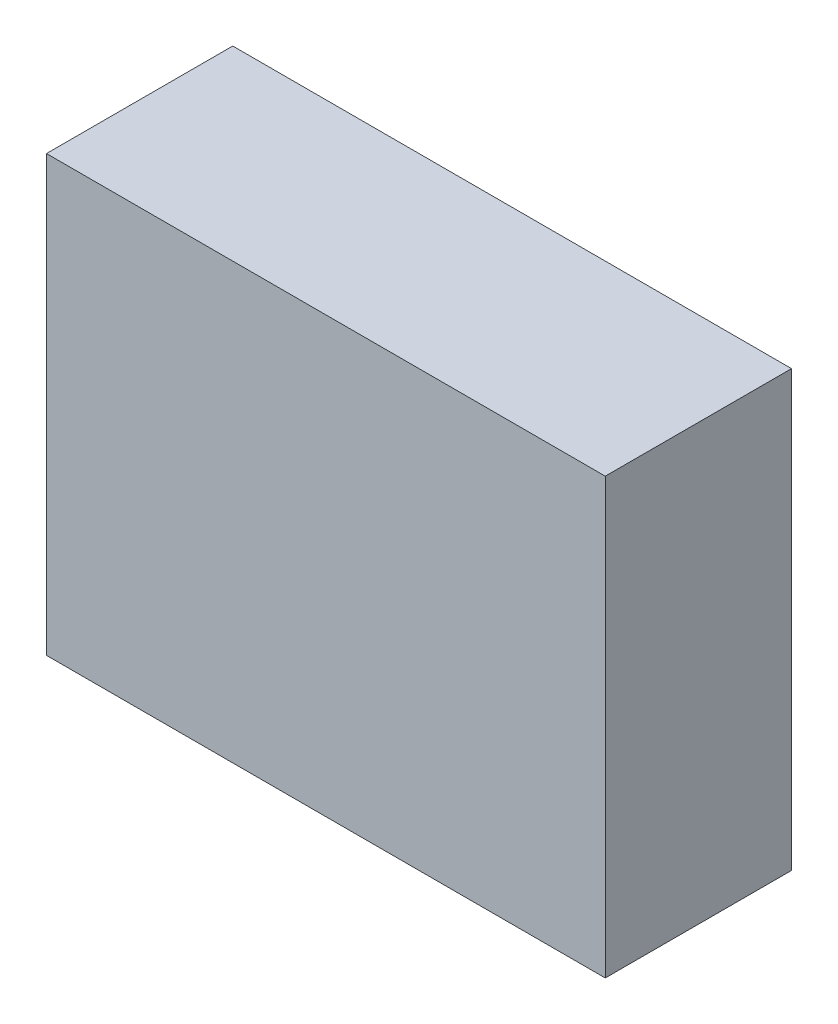
ISO-10303-21;
HEADER;
FILE_DESCRIPTION(('STEP AP214'),'2;1');
FILE_NAME('part.step','',(''),(''),'','','');
FILE_SCHEMA(('AUTOMOTIVE_DESIGN { 1 0 10303 214 1 1 1 1 }'));
ENDSEC;
DATA;
#1=APPLICATION_CONTEXT('core data for automotive mechanical design processes');
#2=APPLICATION_PROTOCOL_DEFINITION('international standard','automotive_design',2000,#1);
#3=PRODUCT_CONTEXT('',#1,'mechanical');
#4=PRODUCT('Part','Part','',(#3));
#5=PRODUCT_RELATED_PRODUCT_CATEGORY('part','',(#4));
#6=PRODUCT_DEFINITION_FORMATION('','',#4);
#7=PRODUCT_DEFINITION_CONTEXT('part definition',#1,'design');
#8=PRODUCT_DEFINITION('design','',#6,#7);
#9=PRODUCT_DEFINITION_SHAPE('','',#8);
#10=(LENGTH_UNIT() NAMED_UNIT(*) SI_UNIT(.MILLI.,.METRE.));
#11=(NAMED_UNIT(*) PLANE_ANGLE_UNIT() SI_UNIT($,.RADIAN.));
#12=(NAMED_UNIT(*) SI_UNIT($,.STERADIAN.) SOLID_ANGLE_UNIT());
#13=UNCERTAINTY_MEASURE_WITH_UNIT(LENGTH_MEASURE(1.E-05),#10,'distance_accuracy_value','');
#14=(GEOMETRIC_REPRESENTATION_CONTEXT(3) GLOBAL_UNCERTAINTY_ASSIGNED_CONTEXT((#13)) GLOBAL_UNIT_ASSIGNED_CONTEXT((#10,
#11,#12)) REPRESENTATION_CONTEXT('',''));
#15=CARTESIAN_POINT('',(0.,0.,0.));
#16=DIRECTION('',(0.,0.,1.));
#17=DIRECTION('',(1.,0.,0.));
#18=AXIS2_PLACEMENT_3D('',#15,#16,#17);
#19=CARTESIAN_POINT('',(0.,0.,300.));
#20=DIRECTION('',(1.,0.,0.));
#21=DIRECTION('',(0.,0.,-1.));
#22=AXIS2_PLACEMENT_3D('',#19,#20,#21);
#23=PLANE('',#22);
#24=DIRECTION('',(0.,-1.,0.));
#25=VECTOR('',#24,1.);
#26=CARTESIAN_POINT('',(0.,0.,0.));
#27=LINE('',#26,#25);
#28=CARTESIAN_POINT('',(0.,700.,0.));
#29=VERTEX_POINT('',#28);
#30=CARTESIAN_POINT('',(0.,0.,0.));
#31=VERTEX_POINT('',#30);
#32=EDGE_CURVE('E153',#29,#31,#27,.T.);
#33=ORIENTED_EDGE('',*,*,#32,.T.);
#34=DIRECTION('',(0.,0.,-1.));
#35=VECTOR('',#34,1.);
#36=CARTESIAN_POINT('',(0.,0.,300.));
#37=LINE('',#36,#35);
#38=CARTESIAN_POINT('',(0.,0.,300.));
#39=VERTEX_POINT('',#38);
#40=EDGE_CURVE('E142',#39,#31,#37,.T.);
#41=ORIENTED_EDGE('',*,*,#40,.F.);
#42=DIRECTION('',(0.,-1.,0.));
#43=VECTOR('',#42,1.);
#44=CARTESIAN_POINT('',(0.,0.,300.));
#45=LINE('',#44,#43);
#46=CARTESIAN_POINT('',(0.,700.,300.));
#47=VERTEX_POINT('',#46);
#48=EDGE_CURVE('E134',#47,#39,#45,.T.);
#49=ORIENTED_EDGE('',*,*,#48,.F.);
#50=DIRECTION('',(0.,0.,-1.));
#51=VECTOR('',#50,1.);
#52=CARTESIAN_POINT('',(0.,700.,300.));
#53=LINE('',#52,#51);
#54=EDGE_CURVE('E149',#47,#29,#53,.T.);
#55=ORIENTED_EDGE('',*,*,#54,.T.);
#56=EDGE_LOOP('',(#33,#41,#49,#55));
#57=FACE_BOUND('',#56,.T.);
#58=ADVANCED_FACE('F42',(#57),#23,.F.);
#59=CARTESIAN_POINT('',(0.,0.,300.));
#60=DIRECTION('',(0.,1.,0.));
#61=DIRECTION('',(0.,0.,1.));
#62=AXIS2_PLACEMENT_3D('',#59,#60,#61);
#63=PLANE('',#62);
#64=DIRECTION('',(1.,0.,0.));
#65=VECTOR('',#64,1.);
#66=CARTESIAN_POINT('',(0.,0.,0.));
#67=LINE('',#66,#65);
#68=CARTESIAN_POINT('',(900.,0.,0.));
#69=VERTEX_POINT('',#68);
#70=EDGE_CURVE('E140',#31,#69,#67,.T.);
#71=ORIENTED_EDGE('',*,*,#70,.T.);
#72=DIRECTION('',(0.,0.,-1.));
#73=VECTOR('',#72,1.);
#74=CARTESIAN_POINT('',(900.,0.,300.));
#75=LINE('',#74,#73);
#76=CARTESIAN_POINT('',(900.,0.,300.));
#77=VERTEX_POINT('',#76);
#78=EDGE_CURVE('E138',#77,#69,#75,.T.);
#79=ORIENTED_EDGE('',*,*,#78,.F.);
#80=DIRECTION('',(1.,0.,0.));
#81=VECTOR('',#80,1.);
#82=CARTESIAN_POINT('',(0.,0.,300.));
#83=LINE('',#82,#81);
#84=EDGE_CURVE('E129',#39,#77,#83,.T.);
#85=ORIENTED_EDGE('',*,*,#84,.F.);
#86=ORIENTED_EDGE('',*,*,#40,.T.);
#87=EDGE_LOOP('',(#71,#79,#85,#86));
#88=FACE_BOUND('',#87,.T.);
#89=ADVANCED_FACE('F139',(#88),#63,.F.);
#90=CARTESIAN_POINT('',(900.,0.,300.));
#91=DIRECTION('',(-1.,0.,0.));
#92=DIRECTION('',(0.,0.,1.));
#93=AXIS2_PLACEMENT_3D('',#90,#91,#92);
#94=PLANE('',#93);
#95=DIRECTION('',(0.,1.,0.));
#96=VECTOR('',#95,1.);
#97=CARTESIAN_POINT('',(900.,0.,0.));
#98=LINE('',#97,#96);
#99=CARTESIAN_POINT('',(900.,700.,0.));
#100=VERTEX_POINT('',#99);
#101=EDGE_CURVE('E115',#69,#100,#98,.T.);
#102=ORIENTED_EDGE('',*,*,#101,.T.);
#103=DIRECTION('',(0.,0.,-1.));
#104=VECTOR('',#103,1.);
#105=CARTESIAN_POINT('',(900.,700.,300.));
#106=LINE('',#105,#104);
#107=CARTESIAN_POINT('',(900.,700.,300.));
#108=VERTEX_POINT('',#107);
#109=EDGE_CURVE('E143',#108,#100,#106,.T.);
#110=ORIENTED_EDGE('',*,*,#109,.F.);
#111=DIRECTION('',(0.,1.,0.));
#112=VECTOR('',#111,1.);
#113=CARTESIAN_POINT('',(900.,0.,300.));
#114=LINE('',#113,#112);
#115=EDGE_CURVE('E132',#77,#108,#114,.T.);
#116=ORIENTED_EDGE('',*,*,#115,.F.);
#117=ORIENTED_EDGE('',*,*,#78,.T.);
#118=EDGE_LOOP('',(#102,#110,#116,#117));
#119=FACE_BOUND('',#118,.T.);
#120=ADVANCED_FACE('F145',(#119),#94,.F.);
#121=CARTESIAN_POINT('',(0.,700.,300.));
#122=DIRECTION('',(0.,-1.,0.));
#123=DIRECTION('',(0.,0.,-1.));
#124=AXIS2_PLACEMENT_3D('',#121,#122,#123);
#125=PLANE('',#124);
#126=DIRECTION('',(-1.,0.,0.));
#127=VECTOR('',#126,1.);
#128=CARTESIAN_POINT('',(0.,700.,0.));
#129=LINE('',#128,#127);
#130=EDGE_CURVE('E121',#100,#29,#129,.T.);
#131=ORIENTED_EDGE('',*,*,#130,.T.);
#132=ORIENTED_EDGE('',*,*,#54,.F.);
#133=DIRECTION('',(-1.,0.,0.));
#134=VECTOR('',#133,1.);
#135=CARTESIAN_POINT('',(0.,700.,300.));
#136=LINE('',#135,#134);
#137=EDGE_CURVE('E98',#108,#47,#136,.T.);
#138=ORIENTED_EDGE('',*,*,#137,.F.);
#139=ORIENTED_EDGE('',*,*,#109,.T.);
#140=EDGE_LOOP('',(#131,#132,#138,#139));
#141=FACE_BOUND('',#140,.T.);
#142=ADVANCED_FACE('F235',(#141),#125,.F.);
#143=CARTESIAN_POINT('',(0.,0.,300.));
#144=DIRECTION('',(0.,0.,-1.));
#145=DIRECTION('',(-1.,0.,0.));
#146=AXIS2_PLACEMENT_3D('',#143,#144,#145);
#147=PLANE('',#146);
#148=ORIENTED_EDGE('',*,*,#48,.T.);
#149=ORIENTED_EDGE('',*,*,#84,.T.);
#150=ORIENTED_EDGE('',*,*,#115,.T.);
#151=ORIENTED_EDGE('',*,*,#137,.T.);
#152=EDGE_LOOP('',(#148,#149,#150,#151));
#153=FACE_BOUND('',#152,.T.);
#154=ADVANCED_FACE('F130',(#153),#147,.F.);
#155=CARTESIAN_POINT('',(0.,0.,0.));
#156=DIRECTION('',(0.,0.,-1.));
#157=DIRECTION('',(-1.,0.,0.));
#158=AXIS2_PLACEMENT_3D('',#155,#156,#157);
#159=PLANE('',#158);
#160=ORIENTED_EDGE('',*,*,#32,.F.);
#161=ORIENTED_EDGE('',*,*,#130,.F.);
#162=ORIENTED_EDGE('',*,*,#101,.F.);
#163=ORIENTED_EDGE('',*,*,#70,.F.);
#164=EDGE_LOOP('',(#160,#161,#162,#163));
#165=FACE_BOUND('',#164,.T.);
#166=ADVANCED_FACE('F238',(#165),#159,.T.);
#167=CLOSED_SHELL('',(#58,#89,#120,#142,#154,#166));
#168=CARTESIAN_POINT('',(10.,0.,300.));
#169=DIRECTION('',(1.,0.,0.));
#170=DIRECTION('',(0.,0.,-1.));
#171=AXIS2_PLACEMENT_3D('',#168,#169,#170);
#172=PLANE('',#171);
#173=DIRECTION('',(0.,-1.,0.));
#174=VECTOR('',#173,1.);
#175=CARTESIAN_POINT('',(10.,0.,10.));
#176=LINE('',#175,#174);
#177=CARTESIAN_POINT('',(10.,690.,10.));
#178=VERTEX_POINT('',#177);
#179=CARTESIAN_POINT('',(10.,10.,10.));
#180=VERTEX_POINT('',#179);
#181=EDGE_CURVE('E46',#178,#180,#176,.T.);
#182=ORIENTED_EDGE('',*,*,#181,.F.);
#183=DIRECTION('',(0.,0.,-1.));
#184=VECTOR('',#183,1.);
#185=CARTESIAN_POINT('',(10.,690.,300.));
#186=LINE('',#185,#184);
#187=CARTESIAN_POINT('',(10.,690.,290.));
#188=VERTEX_POINT('',#187);
#189=EDGE_CURVE('E193',#188,#178,#186,.T.);
#190=ORIENTED_EDGE('',*,*,#189,.F.);
#191=DIRECTION('',(0.,-1.,0.));
#192=VECTOR('',#191,1.);
#193=CARTESIAN_POINT('',(10.,0.,290.));
#194=LINE('',#193,#192);
#195=CARTESIAN_POINT('',(10.,10.,290.));
#196=VERTEX_POINT('',#195);
#197=EDGE_CURVE('E173',#188,#196,#194,.T.);
#198=ORIENTED_EDGE('',*,*,#197,.T.);
#199=DIRECTION('',(0.,0.,-1.));
#200=VECTOR('',#199,1.);
#201=CARTESIAN_POINT('',(10.,10.,300.));
#202=LINE('',#201,#200);
#203=EDGE_CURVE('E189',#196,#180,#202,.T.);
#204=ORIENTED_EDGE('',*,*,#203,.T.);
#205=EDGE_LOOP('',(#182,#190,#198,#204));
#206=FACE_BOUND('',#205,.T.);
#207=ADVANCED_FACE('F202',(#206),#172,.T.);
#208=CARTESIAN_POINT('',(0.,10.,300.));
#209=DIRECTION('',(0.,1.,0.));
#210=DIRECTION('',(0.,0.,1.));
#211=AXIS2_PLACEMENT_3D('',#208,#209,#210);
#212=PLANE('',#211);
#213=DIRECTION('',(1.,0.,0.));
#214=VECTOR('',#213,1.);
#215=CARTESIAN_POINT('',(0.,10.,10.));
#216=LINE('',#215,#214);
#217=CARTESIAN_POINT('',(890.,10.,10.));
#218=VERTEX_POINT('',#217);
#219=EDGE_CURVE('E63',#180,#218,#216,.T.);
#220=ORIENTED_EDGE('',*,*,#219,.F.);
#221=ORIENTED_EDGE('',*,*,#203,.F.);
#222=DIRECTION('',(1.,0.,0.));
#223=VECTOR('',#222,1.);
#224=CARTESIAN_POINT('',(0.,10.,290.));
#225=LINE('',#224,#223);
#226=CARTESIAN_POINT('',(890.,10.,290.));
#227=VERTEX_POINT('',#226);
#228=EDGE_CURVE('E86',#196,#227,#225,.T.);
#229=ORIENTED_EDGE('',*,*,#228,.T.);
#230=DIRECTION('',(0.,0.,-1.));
#231=VECTOR('',#230,1.);
#232=CARTESIAN_POINT('',(890.,10.,300.));
#233=LINE('',#232,#231);
#234=EDGE_CURVE('E183',#227,#218,#233,.T.);
#235=ORIENTED_EDGE('',*,*,#234,.T.);
#236=EDGE_LOOP('',(#220,#221,#229,#235));
#237=FACE_BOUND('',#236,.T.);
#238=ADVANCED_FACE('F203',(#237),#212,.T.);
#239=CARTESIAN_POINT('',(890.,0.,300.));
#240=DIRECTION('',(-1.,0.,0.));
#241=DIRECTION('',(0.,0.,1.));
#242=AXIS2_PLACEMENT_3D('',#239,#240,#241);
#243=PLANE('',#242);
#244=DIRECTION('',(0.,1.,0.));
#245=VECTOR('',#244,1.);
#246=CARTESIAN_POINT('',(890.,0.,10.));
#247=LINE('',#246,#245);
#248=CARTESIAN_POINT('',(890.,690.,10.));
#249=VERTEX_POINT('',#248);
#250=EDGE_CURVE('E186',#218,#249,#247,.T.);
#251=ORIENTED_EDGE('',*,*,#250,.F.);
#252=ORIENTED_EDGE('',*,*,#234,.F.);
#253=DIRECTION('',(0.,1.,0.));
#254=VECTOR('',#253,1.);
#255=CARTESIAN_POINT('',(890.,0.,290.));
#256=LINE('',#255,#254);
#257=CARTESIAN_POINT('',(890.,690.,290.));
#258=VERTEX_POINT('',#257);
#259=EDGE_CURVE('E54',#227,#258,#256,.T.);
#260=ORIENTED_EDGE('',*,*,#259,.T.);
#261=DIRECTION('',(0.,0.,-1.));
#262=VECTOR('',#261,1.);
#263=CARTESIAN_POINT('',(890.,690.,300.));
#264=LINE('',#263,#262);
#265=EDGE_CURVE('E176',#258,#249,#264,.T.);
#266=ORIENTED_EDGE('',*,*,#265,.T.);
#267=EDGE_LOOP('',(#251,#252,#260,#266));
#268=FACE_BOUND('',#267,.T.);
#269=ADVANCED_FACE('F207',(#268),#243,.T.);
#270=CARTESIAN_POINT('',(0.,690.,300.));
#271=DIRECTION('',(0.,-1.,0.));
#272=DIRECTION('',(0.,0.,-1.));
#273=AXIS2_PLACEMENT_3D('',#270,#271,#272);
#274=PLANE('',#273);
#275=DIRECTION('',(-1.,0.,0.));
#276=VECTOR('',#275,1.);
#277=CARTESIAN_POINT('',(0.,690.,10.));
#278=LINE('',#277,#276);
#279=EDGE_CURVE('E180',#249,#178,#278,.T.);
#280=ORIENTED_EDGE('',*,*,#279,.F.);
#281=ORIENTED_EDGE('',*,*,#265,.F.);
#282=DIRECTION('',(-1.,0.,0.));
#283=VECTOR('',#282,1.);
#284=CARTESIAN_POINT('',(0.,690.,290.));
#285=LINE('',#284,#283);
#286=EDGE_CURVE('E11',#258,#188,#285,.T.);
#287=ORIENTED_EDGE('',*,*,#286,.T.);
#288=ORIENTED_EDGE('',*,*,#189,.T.);
#289=EDGE_LOOP('',(#280,#281,#287,#288));
#290=FACE_BOUND('',#289,.T.);
#291=ADVANCED_FACE('F211',(#290),#274,.T.);
#292=CARTESIAN_POINT('',(0.,0.,290.));
#293=DIRECTION('',(0.,0.,-1.));
#294=DIRECTION('',(-1.,0.,0.));
#295=AXIS2_PLACEMENT_3D('',#292,#293,#294);
#296=PLANE('',#295);
#297=ORIENTED_EDGE('',*,*,#197,.F.);
#298=ORIENTED_EDGE('',*,*,#286,.F.);
#299=ORIENTED_EDGE('',*,*,#259,.F.);
#300=ORIENTED_EDGE('',*,*,#228,.F.);
#301=EDGE_LOOP('',(#297,#298,#299,#300));
#302=FACE_BOUND('',#301,.T.);
#303=ADVANCED_FACE('F210',(#302),#296,.T.);
#304=CARTESIAN_POINT('',(0.,0.,10.));
#305=DIRECTION('',(0.,0.,-1.));
#306=DIRECTION('',(-1.,0.,0.));
#307=AXIS2_PLACEMENT_3D('',#304,#305,#306);
#308=PLANE('',#307);
#309=ORIENTED_EDGE('',*,*,#181,.T.);
#310=ORIENTED_EDGE('',*,*,#219,.T.);
#311=ORIENTED_EDGE('',*,*,#250,.T.);
#312=ORIENTED_EDGE('',*,*,#279,.T.);
#313=EDGE_LOOP('',(#309,#310,#311,#312));
#314=FACE_BOUND('',#313,.T.);
#315=ADVANCED_FACE('F44',(#314),#308,.F.);
#316=CLOSED_SHELL('',(#207,#238,#269,#291,#303,#315));
#317=ORIENTED_CLOSED_SHELL('',*,#316,.T.);
#318=BREP_WITH_VOIDS('B2',#167,(#317));
#319=ADVANCED_BREP_SHAPE_REPRESENTATION('',(#18,#318),#14);
#320=SHAPE_DEFINITION_REPRESENTATION(#9,#319);
ENDSEC;
END-ISO-10303-21;
